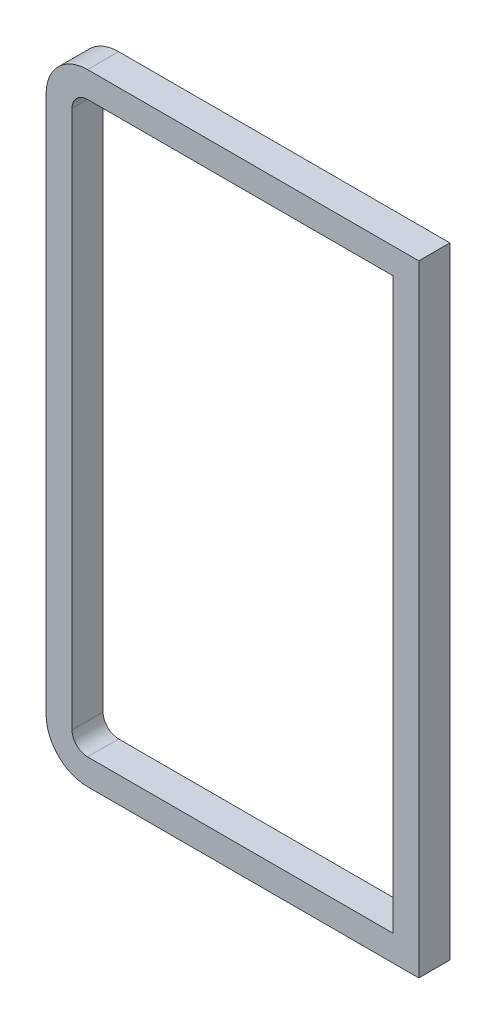
ISO-10303-21;
HEADER;
FILE_DESCRIPTION(('STEP AP214'),'2;1');
FILE_NAME('part.step','',(''),(''),'','','');
FILE_SCHEMA(('AUTOMOTIVE_DESIGN { 1 0 10303 214 1 1 1 1 }'));
ENDSEC;
DATA;
#1=APPLICATION_CONTEXT('core data for automotive mechanical design processes');
#2=APPLICATION_PROTOCOL_DEFINITION('international standard','automotive_design',2000,#1);
#3=PRODUCT_CONTEXT('',#1,'mechanical');
#4=PRODUCT('Part','Part','',(#3));
#5=PRODUCT_RELATED_PRODUCT_CATEGORY('part','',(#4));
#6=PRODUCT_DEFINITION_FORMATION('','',#4);
#7=PRODUCT_DEFINITION_CONTEXT('part definition',#1,'design');
#8=PRODUCT_DEFINITION('design','',#6,#7);
#9=PRODUCT_DEFINITION_SHAPE('','',#8);
#10=(LENGTH_UNIT() NAMED_UNIT(*) SI_UNIT(.MILLI.,.METRE.));
#11=(NAMED_UNIT(*) PLANE_ANGLE_UNIT() SI_UNIT($,.RADIAN.));
#12=(NAMED_UNIT(*) SI_UNIT($,.STERADIAN.) SOLID_ANGLE_UNIT());
#13=UNCERTAINTY_MEASURE_WITH_UNIT(LENGTH_MEASURE(1.E-05),#10,'distance_accuracy_value','');
#14=(GEOMETRIC_REPRESENTATION_CONTEXT(3) GLOBAL_UNCERTAINTY_ASSIGNED_CONTEXT((#13)) GLOBAL_UNIT_ASSIGNED_CONTEXT((#10,
#11,#12)) REPRESENTATION_CONTEXT('',''));
#15=CARTESIAN_POINT('',(0.,0.,0.));
#16=DIRECTION('',(0.,0.,1.));
#17=DIRECTION('',(1.,0.,0.));
#18=AXIS2_PLACEMENT_3D('',#15,#16,#17);
#19=CARTESIAN_POINT('',(914.4,0.,76.2));
#20=DIRECTION('',(-1.,0.,0.));
#21=DIRECTION('',(0.,0.,1.));
#22=AXIS2_PLACEMENT_3D('',#19,#20,#21);
#23=PLANE('',#22);
#24=DIRECTION('',(0.,1.,0.));
#25=VECTOR('',#24,1.);
#26=CARTESIAN_POINT('',(914.4,0.,0.));
#27=LINE('',#26,#25);
#28=CARTESIAN_POINT('',(914.4,0.,0.));
#29=VERTEX_POINT('',#28);
#30=CARTESIAN_POINT('',(914.4,1524.,0.));
#31=VERTEX_POINT('',#30);
#32=EDGE_CURVE('E165',#29,#31,#27,.T.);
#33=ORIENTED_EDGE('',*,*,#32,.T.);
#34=DIRECTION('',(0.,0.,-1.));
#35=VECTOR('',#34,1.);
#36=CARTESIAN_POINT('',(914.4,1524.,76.2));
#37=LINE('',#36,#35);
#38=CARTESIAN_POINT('',(914.4,1524.,76.2));
#39=VERTEX_POINT('',#38);
#40=EDGE_CURVE('E11',#39,#31,#37,.T.);
#41=ORIENTED_EDGE('',*,*,#40,.F.);
#42=DIRECTION('',(0.,1.,0.));
#43=VECTOR('',#42,1.);
#44=CARTESIAN_POINT('',(914.4,0.,76.2));
#45=LINE('',#44,#43);
#46=CARTESIAN_POINT('',(914.4,0.,76.2));
#47=VERTEX_POINT('',#46);
#48=EDGE_CURVE('E173',#47,#39,#45,.T.);
#49=ORIENTED_EDGE('',*,*,#48,.F.);
#50=DIRECTION('',(0.,0.,-1.));
#51=VECTOR('',#50,1.);
#52=CARTESIAN_POINT('',(914.4,0.,76.2));
#53=LINE('',#52,#51);
#54=EDGE_CURVE('E187',#47,#29,#53,.T.);
#55=ORIENTED_EDGE('',*,*,#54,.T.);
#56=EDGE_LOOP('',(#33,#41,#49,#55));
#57=FACE_BOUND('',#56,.T.);
#58=ADVANCED_FACE('F32',(#57),#23,.F.);
#59=CARTESIAN_POINT('',(101.600000000001,1524.,76.2));
#60=DIRECTION('',(0.,-1.,0.));
#61=DIRECTION('',(0.,0.,-1.));
#62=AXIS2_PLACEMENT_3D('',#59,#60,#61);
#63=PLANE('',#62);
#64=DIRECTION('',(-1.,0.,0.));
#65=VECTOR('',#64,1.);
#66=CARTESIAN_POINT('',(101.600000000001,1524.,0.));
#67=LINE('',#66,#65);
#68=CARTESIAN_POINT('',(101.600000000001,1524.,0.));
#69=VERTEX_POINT('',#68);
#70=EDGE_CURVE('E190',#31,#69,#67,.T.);
#71=ORIENTED_EDGE('',*,*,#70,.T.);
#72=DIRECTION('',(0.,0.,-1.));
#73=VECTOR('',#72,1.);
#74=CARTESIAN_POINT('',(101.600000000001,1524.,76.2));
#75=LINE('',#74,#73);
#76=CARTESIAN_POINT('',(101.600000000001,1524.,76.2));
#77=VERTEX_POINT('',#76);
#78=EDGE_CURVE('E39',#77,#69,#75,.T.);
#79=ORIENTED_EDGE('',*,*,#78,.F.);
#80=DIRECTION('',(-1.,0.,0.));
#81=VECTOR('',#80,1.);
#82=CARTESIAN_POINT('',(101.600000000001,1524.,76.2));
#83=LINE('',#82,#81);
#84=EDGE_CURVE('E176',#39,#77,#83,.T.);
#85=ORIENTED_EDGE('',*,*,#84,.F.);
#86=ORIENTED_EDGE('',*,*,#40,.T.);
#87=EDGE_LOOP('',(#71,#79,#85,#86));
#88=FACE_BOUND('',#87,.T.);
#89=ADVANCED_FACE('F235',(#88),#63,.F.);
#90=CARTESIAN_POINT('',(101.6,1422.4,76.2));
#91=DIRECTION('',(0.,0.,-1.));
#92=DIRECTION('',(-1.,0.,0.));
#93=AXIS2_PLACEMENT_3D('',#90,#91,#92);
#94=CYLINDRICAL_SURFACE('',#93,101.6);
#95=CARTESIAN_POINT('',(101.6,1422.4,0.));
#96=DIRECTION('',(0.,0.,1.));
#97=DIRECTION('',(-1.,0.,0.));
#98=AXIS2_PLACEMENT_3D('',#95,#96,#97);
#99=CIRCLE('',#98,101.6);
#100=CARTESIAN_POINT('',(0.,1422.4,0.));
#101=VERTEX_POINT('',#100);
#102=EDGE_CURVE('E192',#69,#101,#99,.T.);
#103=ORIENTED_EDGE('',*,*,#102,.T.);
#104=DIRECTION('',(0.,0.,-1.));
#105=VECTOR('',#104,1.);
#106=CARTESIAN_POINT('',(0.,1422.4,76.2));
#107=LINE('',#106,#105);
#108=CARTESIAN_POINT('',(0.,1422.4,76.2));
#109=VERTEX_POINT('',#108);
#110=EDGE_CURVE('E207',#109,#101,#107,.T.);
#111=ORIENTED_EDGE('',*,*,#110,.F.);
#112=CARTESIAN_POINT('',(101.6,1422.4,76.2));
#113=DIRECTION('',(0.,0.,1.));
#114=DIRECTION('',(-1.,0.,0.));
#115=AXIS2_PLACEMENT_3D('',#112,#113,#114);
#116=CIRCLE('',#115,101.6);
#117=EDGE_CURVE('E179',#77,#109,#116,.T.);
#118=ORIENTED_EDGE('',*,*,#117,.F.);
#119=ORIENTED_EDGE('',*,*,#78,.T.);
#120=EDGE_LOOP('',(#103,#111,#118,#119));
#121=FACE_BOUND('',#120,.T.);
#122=ADVANCED_FACE('F214',(#121),#94,.T.);
#123=CARTESIAN_POINT('',(0.,101.600000000001,76.2));
#124=DIRECTION('',(1.,0.,0.));
#125=DIRECTION('',(0.,0.,-1.));
#126=AXIS2_PLACEMENT_3D('',#123,#124,#125);
#127=PLANE('',#126);
#128=DIRECTION('',(0.,-1.,0.));
#129=VECTOR('',#128,1.);
#130=CARTESIAN_POINT('',(0.,101.600000000001,0.));
#131=LINE('',#130,#129);
#132=CARTESIAN_POINT('',(0.,101.600000000001,0.));
#133=VERTEX_POINT('',#132);
#134=EDGE_CURVE('E194',#101,#133,#131,.T.);
#135=ORIENTED_EDGE('',*,*,#134,.T.);
#136=DIRECTION('',(0.,0.,-1.));
#137=VECTOR('',#136,1.);
#138=CARTESIAN_POINT('',(0.,101.600000000001,76.2));
#139=LINE('',#138,#137);
#140=CARTESIAN_POINT('',(0.,101.600000000001,76.2));
#141=VERTEX_POINT('',#140);
#142=EDGE_CURVE('E204',#141,#133,#139,.T.);
#143=ORIENTED_EDGE('',*,*,#142,.F.);
#144=DIRECTION('',(0.,-1.,0.));
#145=VECTOR('',#144,1.);
#146=CARTESIAN_POINT('',(0.,101.600000000001,76.2));
#147=LINE('',#146,#145);
#148=EDGE_CURVE('E181',#109,#141,#147,.T.);
#149=ORIENTED_EDGE('',*,*,#148,.F.);
#150=ORIENTED_EDGE('',*,*,#110,.T.);
#151=EDGE_LOOP('',(#135,#143,#149,#150));
#152=FACE_BOUND('',#151,.T.);
#153=ADVANCED_FACE('F223',(#152),#127,.F.);
#154=CARTESIAN_POINT('',(101.6,101.6,76.2));
#155=DIRECTION('',(0.,0.,-1.));
#156=DIRECTION('',(-1.,0.,0.));
#157=AXIS2_PLACEMENT_3D('',#154,#155,#156);
#158=CYLINDRICAL_SURFACE('',#157,101.6);
#159=CARTESIAN_POINT('',(101.6,101.6,0.));
#160=DIRECTION('',(0.,0.,1.));
#161=DIRECTION('',(-1.,0.,0.));
#162=AXIS2_PLACEMENT_3D('',#159,#160,#161);
#163=CIRCLE('',#162,101.6);
#164=CARTESIAN_POINT('',(101.600000000001,0.,0.));
#165=VERTEX_POINT('',#164);
#166=EDGE_CURVE('E196',#133,#165,#163,.T.);
#167=ORIENTED_EDGE('',*,*,#166,.T.);
#168=DIRECTION('',(0.,0.,-1.));
#169=VECTOR('',#168,1.);
#170=CARTESIAN_POINT('',(101.600000000001,0.,76.2));
#171=LINE('',#170,#169);
#172=CARTESIAN_POINT('',(101.600000000001,0.,76.2));
#173=VERTEX_POINT('',#172);
#174=EDGE_CURVE('E201',#173,#165,#171,.T.);
#175=ORIENTED_EDGE('',*,*,#174,.F.);
#176=CARTESIAN_POINT('',(101.6,101.6,76.2));
#177=DIRECTION('',(0.,0.,1.));
#178=DIRECTION('',(-1.,0.,0.));
#179=AXIS2_PLACEMENT_3D('',#176,#177,#178);
#180=CIRCLE('',#179,101.6);
#181=EDGE_CURVE('E183',#141,#173,#180,.T.);
#182=ORIENTED_EDGE('',*,*,#181,.F.);
#183=ORIENTED_EDGE('',*,*,#142,.T.);
#184=EDGE_LOOP('',(#167,#175,#182,#183));
#185=FACE_BOUND('',#184,.T.);
#186=ADVANCED_FACE('F227',(#185),#158,.T.);
#187=CARTESIAN_POINT('',(101.600000000001,0.,76.2));
#188=DIRECTION('',(0.,1.,0.));
#189=DIRECTION('',(0.,0.,1.));
#190=AXIS2_PLACEMENT_3D('',#187,#188,#189);
#191=PLANE('',#190);
#192=DIRECTION('',(1.,0.,0.));
#193=VECTOR('',#192,1.);
#194=CARTESIAN_POINT('',(101.600000000001,0.,0.));
#195=LINE('',#194,#193);
#196=EDGE_CURVE('E177',#165,#29,#195,.T.);
#197=ORIENTED_EDGE('',*,*,#196,.T.);
#198=ORIENTED_EDGE('',*,*,#54,.F.);
#199=DIRECTION('',(1.,0.,0.));
#200=VECTOR('',#199,1.);
#201=CARTESIAN_POINT('',(101.600000000001,0.,76.2));
#202=LINE('',#201,#200);
#203=EDGE_CURVE('E185',#173,#47,#202,.T.);
#204=ORIENTED_EDGE('',*,*,#203,.F.);
#205=ORIENTED_EDGE('',*,*,#174,.T.);
#206=EDGE_LOOP('',(#197,#198,#204,#205));
#207=FACE_BOUND('',#206,.T.);
#208=ADVANCED_FACE('F238',(#207),#191,.F.);
#209=CARTESIAN_POINT('',(101.6,1422.4,76.2));
#210=DIRECTION('',(0.,0.,-1.));
#211=DIRECTION('',(-1.,0.,0.));
#212=AXIS2_PLACEMENT_3D('',#209,#210,#211);
#213=PLANE('',#212);
#214=DIRECTION('',(0.,-1.,0.));
#215=VECTOR('',#214,1.);
#216=CARTESIAN_POINT('',(63.5,1422.4,76.2));
#217=LINE('',#216,#215);
#218=CARTESIAN_POINT('',(63.5,1422.4,76.2));
#219=VERTEX_POINT('',#218);
#220=CARTESIAN_POINT('',(63.5,101.600000000001,76.2));
#221=VERTEX_POINT('',#220);
#222=EDGE_CURVE('E153',#219,#221,#217,.T.);
#223=ORIENTED_EDGE('',*,*,#222,.F.);
#224=CARTESIAN_POINT('',(101.6,1422.4,76.2));
#225=DIRECTION('',(0.,0.,1.));
#226=DIRECTION('',(1.,0.,0.));
#227=AXIS2_PLACEMENT_3D('',#224,#225,#226);
#228=CIRCLE('',#227,38.1);
#229=CARTESIAN_POINT('',(101.600000000001,1460.5,76.2));
#230=VERTEX_POINT('',#229);
#231=EDGE_CURVE('E46',#230,#219,#228,.T.);
#232=ORIENTED_EDGE('',*,*,#231,.F.);
#233=DIRECTION('',(-1.,0.,0.));
#234=VECTOR('',#233,1.);
#235=CARTESIAN_POINT('',(850.9,1460.5,76.2));
#236=LINE('',#235,#234);
#237=CARTESIAN_POINT('',(850.9,1460.5,76.2));
#238=VERTEX_POINT('',#237);
#239=EDGE_CURVE('E139',#238,#230,#236,.T.);
#240=ORIENTED_EDGE('',*,*,#239,.F.);
#241=DIRECTION('',(0.,1.,0.));
#242=VECTOR('',#241,1.);
#243=CARTESIAN_POINT('',(850.9,63.5,76.2));
#244=LINE('',#243,#242);
#245=CARTESIAN_POINT('',(850.9,63.5,76.2));
#246=VERTEX_POINT('',#245);
#247=EDGE_CURVE('E142',#246,#238,#244,.T.);
#248=ORIENTED_EDGE('',*,*,#247,.F.);
#249=DIRECTION('',(1.,0.,0.));
#250=VECTOR('',#249,1.);
#251=CARTESIAN_POINT('',(101.6,63.5,76.2));
#252=LINE('',#251,#250);
#253=CARTESIAN_POINT('',(101.6,63.5,76.2));
#254=VERTEX_POINT('',#253);
#255=EDGE_CURVE('E158',#254,#246,#252,.T.);
#256=ORIENTED_EDGE('',*,*,#255,.F.);
#257=CARTESIAN_POINT('',(101.6,101.6,76.2));
#258=DIRECTION('',(0.,0.,1.));
#259=DIRECTION('',(1.,0.,0.));
#260=AXIS2_PLACEMENT_3D('',#257,#258,#259);
#261=CIRCLE('',#260,38.1);
#262=EDGE_CURVE('E155',#221,#254,#261,.T.);
#263=ORIENTED_EDGE('',*,*,#262,.F.);
#264=EDGE_LOOP('',(#223,#232,#240,#248,#256,#263));
#265=FACE_BOUND('',#264,.T.);
#266=ORIENTED_EDGE('',*,*,#48,.T.);
#267=ORIENTED_EDGE('',*,*,#84,.T.);
#268=ORIENTED_EDGE('',*,*,#117,.T.);
#269=ORIENTED_EDGE('',*,*,#148,.T.);
#270=ORIENTED_EDGE('',*,*,#181,.T.);
#271=ORIENTED_EDGE('',*,*,#203,.T.);
#272=EDGE_LOOP('',(#266,#267,#268,#269,#270,#271));
#273=FACE_BOUND('',#272,.T.);
#274=ADVANCED_FACE('F231',(#265,#273),#213,.F.);
#275=CARTESIAN_POINT('',(101.6,1422.4,0.));
#276=DIRECTION('',(0.,0.,-1.));
#277=DIRECTION('',(-1.,0.,0.));
#278=AXIS2_PLACEMENT_3D('',#275,#276,#277);
#279=PLANE('',#278);
#280=CARTESIAN_POINT('',(101.6,1422.4,0.));
#281=DIRECTION('',(0.,0.,1.));
#282=DIRECTION('',(1.,0.,0.));
#283=AXIS2_PLACEMENT_3D('',#280,#281,#282);
#284=CIRCLE('',#283,38.1);
#285=CARTESIAN_POINT('',(101.600000000001,1460.5,0.));
#286=VERTEX_POINT('',#285);
#287=CARTESIAN_POINT('',(63.5,1422.4,0.));
#288=VERTEX_POINT('',#287);
#289=EDGE_CURVE('E122',#286,#288,#284,.T.);
#290=ORIENTED_EDGE('',*,*,#289,.T.);
#291=DIRECTION('',(0.,-1.,0.));
#292=VECTOR('',#291,1.);
#293=CARTESIAN_POINT('',(63.5,1422.4,0.));
#294=LINE('',#293,#292);
#295=CARTESIAN_POINT('',(63.5,101.600000000001,0.));
#296=VERTEX_POINT('',#295);
#297=EDGE_CURVE('E131',#288,#296,#294,.T.);
#298=ORIENTED_EDGE('',*,*,#297,.T.);
#299=CARTESIAN_POINT('',(101.6,101.6,0.));
#300=DIRECTION('',(0.,0.,1.));
#301=DIRECTION('',(1.,0.,0.));
#302=AXIS2_PLACEMENT_3D('',#299,#300,#301);
#303=CIRCLE('',#302,38.1);
#304=CARTESIAN_POINT('',(101.6,63.5,0.));
#305=VERTEX_POINT('',#304);
#306=EDGE_CURVE('E54',#296,#305,#303,.T.);
#307=ORIENTED_EDGE('',*,*,#306,.T.);
#308=DIRECTION('',(1.,0.,0.));
#309=VECTOR('',#308,1.);
#310=CARTESIAN_POINT('',(101.6,63.5,0.));
#311=LINE('',#310,#309);
#312=CARTESIAN_POINT('',(850.9,63.5,0.));
#313=VERTEX_POINT('',#312);
#314=EDGE_CURVE('E146',#305,#313,#311,.T.);
#315=ORIENTED_EDGE('',*,*,#314,.T.);
#316=DIRECTION('',(0.,1.,0.));
#317=VECTOR('',#316,1.);
#318=CARTESIAN_POINT('',(850.9,63.5,0.));
#319=LINE('',#318,#317);
#320=CARTESIAN_POINT('',(850.9,1460.5,0.));
#321=VERTEX_POINT('',#320);
#322=EDGE_CURVE('E149',#313,#321,#319,.T.);
#323=ORIENTED_EDGE('',*,*,#322,.T.);
#324=DIRECTION('',(-1.,0.,0.));
#325=VECTOR('',#324,1.);
#326=CARTESIAN_POINT('',(850.9,1460.5,0.));
#327=LINE('',#326,#325);
#328=EDGE_CURVE('E128',#321,#286,#327,.T.);
#329=ORIENTED_EDGE('',*,*,#328,.T.);
#330=EDGE_LOOP('',(#290,#298,#307,#315,#323,#329));
#331=FACE_BOUND('',#330,.T.);
#332=ORIENTED_EDGE('',*,*,#32,.F.);
#333=ORIENTED_EDGE('',*,*,#196,.F.);
#334=ORIENTED_EDGE('',*,*,#166,.F.);
#335=ORIENTED_EDGE('',*,*,#134,.F.);
#336=ORIENTED_EDGE('',*,*,#102,.F.);
#337=ORIENTED_EDGE('',*,*,#70,.F.);
#338=EDGE_LOOP('',(#332,#333,#334,#335,#336,#337));
#339=FACE_BOUND('',#338,.T.);
#340=ADVANCED_FACE('F135',(#331,#339),#279,.T.);
#341=CARTESIAN_POINT('',(101.6,1422.4,0.));
#342=DIRECTION('',(0.,0.,1.));
#343=DIRECTION('',(1.,0.,0.));
#344=AXIS2_PLACEMENT_3D('',#341,#342,#343);
#345=CYLINDRICAL_SURFACE('',#344,38.1);
#346=ORIENTED_EDGE('',*,*,#231,.T.);
#347=DIRECTION('',(0.,0.,1.));
#348=VECTOR('',#347,1.);
#349=CARTESIAN_POINT('',(63.5,1422.4,0.));
#350=LINE('',#349,#348);
#351=EDGE_CURVE('E118',#288,#219,#350,.T.);
#352=ORIENTED_EDGE('',*,*,#351,.F.);
#353=ORIENTED_EDGE('',*,*,#289,.F.);
#354=DIRECTION('',(0.,0.,1.));
#355=VECTOR('',#354,1.);
#356=CARTESIAN_POINT('',(101.600000000001,1460.5,0.));
#357=LINE('',#356,#355);
#358=EDGE_CURVE('E163',#286,#230,#357,.T.);
#359=ORIENTED_EDGE('',*,*,#358,.T.);
#360=EDGE_LOOP('',(#346,#352,#353,#359));
#361=FACE_BOUND('',#360,.T.);
#362=ADVANCED_FACE('F120',(#361),#345,.F.);
#363=CARTESIAN_POINT('',(850.9,1460.5,0.));
#364=DIRECTION('',(0.,1.,0.));
#365=DIRECTION('',(0.,0.,1.));
#366=AXIS2_PLACEMENT_3D('',#363,#364,#365);
#367=PLANE('',#366);
#368=ORIENTED_EDGE('',*,*,#239,.T.);
#369=ORIENTED_EDGE('',*,*,#358,.F.);
#370=ORIENTED_EDGE('',*,*,#328,.F.);
#371=DIRECTION('',(0.,0.,1.));
#372=VECTOR('',#371,1.);
#373=CARTESIAN_POINT('',(850.9,1460.5,0.));
#374=LINE('',#373,#372);
#375=EDGE_CURVE('E166',#321,#238,#374,.T.);
#376=ORIENTED_EDGE('',*,*,#375,.T.);
#377=EDGE_LOOP('',(#368,#369,#370,#376));
#378=FACE_BOUND('',#377,.T.);
#379=ADVANCED_FACE('F293',(#378),#367,.F.);
#380=CARTESIAN_POINT('',(850.9,63.5,0.));
#381=DIRECTION('',(1.,0.,0.));
#382=DIRECTION('',(0.,0.,-1.));
#383=AXIS2_PLACEMENT_3D('',#380,#381,#382);
#384=PLANE('',#383);
#385=ORIENTED_EDGE('',*,*,#247,.T.);
#386=ORIENTED_EDGE('',*,*,#375,.F.);
#387=ORIENTED_EDGE('',*,*,#322,.F.);
#388=DIRECTION('',(0.,0.,1.));
#389=VECTOR('',#388,1.);
#390=CARTESIAN_POINT('',(850.9,63.5,0.));
#391=LINE('',#390,#389);
#392=EDGE_CURVE('E168',#313,#246,#391,.T.);
#393=ORIENTED_EDGE('',*,*,#392,.T.);
#394=EDGE_LOOP('',(#385,#386,#387,#393));
#395=FACE_BOUND('',#394,.T.);
#396=ADVANCED_FACE('F302',(#395),#384,.F.);
#397=CARTESIAN_POINT('',(101.6,63.5,0.));
#398=DIRECTION('',(0.,-1.,0.));
#399=DIRECTION('',(0.,0.,-1.));
#400=AXIS2_PLACEMENT_3D('',#397,#398,#399);
#401=PLANE('',#400);
#402=ORIENTED_EDGE('',*,*,#255,.T.);
#403=ORIENTED_EDGE('',*,*,#392,.F.);
#404=ORIENTED_EDGE('',*,*,#314,.F.);
#405=DIRECTION('',(0.,0.,1.));
#406=VECTOR('',#405,1.);
#407=CARTESIAN_POINT('',(101.6,63.5,0.));
#408=LINE('',#407,#406);
#409=EDGE_CURVE('E170',#305,#254,#408,.T.);
#410=ORIENTED_EDGE('',*,*,#409,.T.);
#411=EDGE_LOOP('',(#402,#403,#404,#410));
#412=FACE_BOUND('',#411,.T.);
#413=ADVANCED_FACE('F312',(#412),#401,.F.);
#414=CARTESIAN_POINT('',(101.6,101.6,0.));
#415=DIRECTION('',(0.,0.,1.));
#416=DIRECTION('',(1.,0.,0.));
#417=AXIS2_PLACEMENT_3D('',#414,#415,#416);
#418=CYLINDRICAL_SURFACE('',#417,38.1);
#419=ORIENTED_EDGE('',*,*,#262,.T.);
#420=ORIENTED_EDGE('',*,*,#409,.F.);
#421=ORIENTED_EDGE('',*,*,#306,.F.);
#422=DIRECTION('',(0.,0.,1.));
#423=VECTOR('',#422,1.);
#424=CARTESIAN_POINT('',(63.5,101.600000000001,0.));
#425=LINE('',#424,#423);
#426=EDGE_CURVE('E127',#296,#221,#425,.T.);
#427=ORIENTED_EDGE('',*,*,#426,.T.);
#428=EDGE_LOOP('',(#419,#420,#421,#427));
#429=FACE_BOUND('',#428,.T.);
#430=ADVANCED_FACE('F322',(#429),#418,.F.);
#431=CARTESIAN_POINT('',(63.5,1422.4,0.));
#432=DIRECTION('',(-1.,0.,0.));
#433=DIRECTION('',(0.,0.,1.));
#434=AXIS2_PLACEMENT_3D('',#431,#432,#433);
#435=PLANE('',#434);
#436=ORIENTED_EDGE('',*,*,#222,.T.);
#437=ORIENTED_EDGE('',*,*,#426,.F.);
#438=ORIENTED_EDGE('',*,*,#297,.F.);
#439=ORIENTED_EDGE('',*,*,#351,.T.);
#440=EDGE_LOOP('',(#436,#437,#438,#439));
#441=FACE_BOUND('',#440,.T.);
#442=ADVANCED_FACE('F132',(#441),#435,.F.);
#443=CLOSED_SHELL('',(#58,#89,#122,#153,#186,#208,#274,#340,#362,#379,#396,#413,#430,#442));
#444=MANIFOLD_SOLID_BREP('B2',#443);
#445=ADVANCED_BREP_SHAPE_REPRESENTATION('',(#18,#444),#14);
#446=SHAPE_DEFINITION_REPRESENTATION(#9,#445);
ENDSEC;
END-ISO-10303-21;
